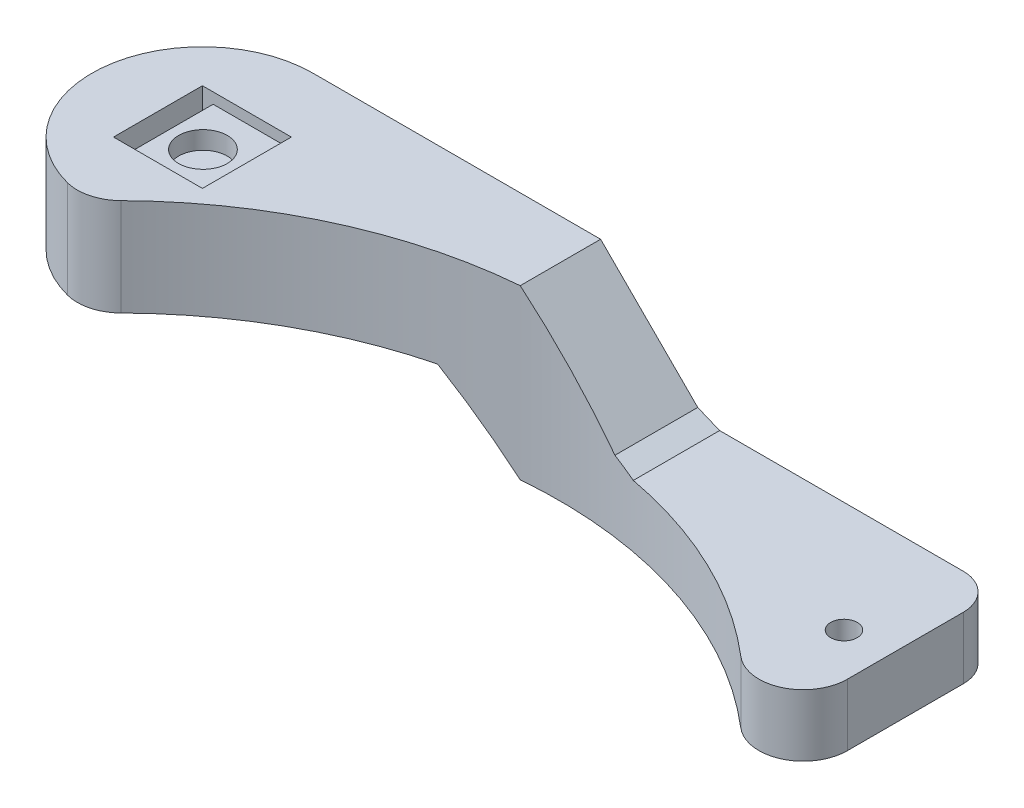
ISO-10303-21;
HEADER;
FILE_DESCRIPTION(('STEP AP214'),'2;1');
FILE_NAME('part.step','',(''),(''),'','','');
FILE_SCHEMA(('AUTOMOTIVE_DESIGN { 1 0 10303 214 1 1 1 1 }'));
ENDSEC;
DATA;
#1=APPLICATION_CONTEXT('core data for automotive mechanical design processes');
#2=APPLICATION_PROTOCOL_DEFINITION('international standard','automotive_design',2000,#1);
#3=PRODUCT_CONTEXT('',#1,'mechanical');
#4=PRODUCT('Part','Part','',(#3));
#5=PRODUCT_RELATED_PRODUCT_CATEGORY('part','',(#4));
#6=PRODUCT_DEFINITION_FORMATION('','',#4);
#7=PRODUCT_DEFINITION_CONTEXT('part definition',#1,'design');
#8=PRODUCT_DEFINITION('design','',#6,#7);
#9=PRODUCT_DEFINITION_SHAPE('','',#8);
#10=(LENGTH_UNIT() NAMED_UNIT(*) SI_UNIT(.MILLI.,.METRE.));
#11=(NAMED_UNIT(*) PLANE_ANGLE_UNIT() SI_UNIT($,.RADIAN.));
#12=(NAMED_UNIT(*) SI_UNIT($,.STERADIAN.) SOLID_ANGLE_UNIT());
#13=UNCERTAINTY_MEASURE_WITH_UNIT(LENGTH_MEASURE(1.E-05),#10,'distance_accuracy_value','');
#14=(GEOMETRIC_REPRESENTATION_CONTEXT(3) GLOBAL_UNCERTAINTY_ASSIGNED_CONTEXT((#13)) GLOBAL_UNIT_ASSIGNED_CONTEXT((#10,
#11,#12)) REPRESENTATION_CONTEXT('',''));
#15=CARTESIAN_POINT('',(0.,0.,0.));
#16=DIRECTION('',(0.,0.,1.));
#17=DIRECTION('',(1.,0.,0.));
#18=AXIS2_PLACEMENT_3D('',#15,#16,#17);
#19=CARTESIAN_POINT('',(10.9748737341531,8.02512626584707,-21.5));
#20=DIRECTION('',(0.382683432365087,0.923879532511288,0.));
#21=DIRECTION('',(0.,0.,1.));
#22=AXIS2_PLACEMENT_3D('',#19,#20,#21);
#23=PLANE('',#22);
#24=DIRECTION('',(0.,0.,-1.));
#25=VECTOR('',#24,1.);
#26=CARTESIAN_POINT('',(10.9748737341531,8.02512626584707,-3.14234152761216));
#27=LINE('',#26,#25);
#28=CARTESIAN_POINT('',(10.9748737341531,8.02512626584704,-3.14234152761216));
#29=VERTEX_POINT('',#28);
#30=CARTESIAN_POINT('',(10.9748737341531,8.02512626584706,-12.5));
#31=VERTEX_POINT('',#30);
#32=EDGE_CURVE('E224',#29,#31,#27,.T.);
#33=ORIENTED_EDGE('',*,*,#32,.F.);
#34=CARTESIAN_POINT('',(4.24999999999998,10.8106601717798,46.4033552911803));
#35=DIRECTION('',(0.382683432365087,0.923879532511288,0.));
#36=DIRECTION('',(0.923879532511288,-0.382683432365087,0.));
#37=AXIS2_PLACEMENT_3D('',#34,#35,#36);
#38=ELLIPSE('',#37,54.1196100146196,50.);
#39=CARTESIAN_POINT('',(13.449747468306,7.,-2.74300415201142));
#40=VERTEX_POINT('',#39);
#41=EDGE_CURVE('E48',#29,#40,#38,.F.);
#42=ORIENTED_EDGE('',*,*,#41,.T.);
#43=DIRECTION('',(0.,0.,1.));
#44=VECTOR('',#43,1.);
#45=CARTESIAN_POINT('',(13.449747468306,7.,-3.14234152761216));
#46=LINE('',#45,#44);
#47=CARTESIAN_POINT('',(13.449747468306,7.,-12.5));
#48=VERTEX_POINT('',#47);
#49=EDGE_CURVE('E227',#48,#40,#46,.T.);
#50=ORIENTED_EDGE('',*,*,#49,.F.);
#51=DIRECTION('',(-0.923879532511288,0.382683432365087,0.));
#52=VECTOR('',#51,1.);
#53=CARTESIAN_POINT('',(-40.6828733497066,29.4224657096208,-12.5));
#54=LINE('',#53,#52);
#55=EDGE_CURVE('E13',#48,#31,#54,.T.);
#56=ORIENTED_EDGE('',*,*,#55,.T.);
#57=EDGE_LOOP('',(#33,#42,#50,#56));
#58=FACE_BOUND('',#57,.T.);
#59=ADVANCED_FACE('F41',(#58),#23,.T.);
#60=CARTESIAN_POINT('',(-32.5,19.,0.));
#61=DIRECTION('',(0.,-1.,0.));
#62=DIRECTION('',(0.,0.,-1.));
#63=AXIS2_PLACEMENT_3D('',#60,#61,#62);
#64=CYLINDRICAL_SURFACE('',#63,12.5);
#65=CARTESIAN_POINT('',(-32.5,7.99999999999999,0.));
#66=DIRECTION('',(0.,-1.,0.));
#67=DIRECTION('',(1.,0.,0.));
#68=AXIS2_PLACEMENT_3D('',#65,#66,#67);
#69=CIRCLE('',#68,12.5);
#70=CARTESIAN_POINT('',(-35.6429668726142,7.99999999999999,12.0984197000125));
#71=VERTEX_POINT('',#70);
#72=CARTESIAN_POINT('',(-32.5,7.99999999999999,-12.5));
#73=VERTEX_POINT('',#72);
#74=EDGE_CURVE('E197',#71,#73,#69,.T.);
#75=ORIENTED_EDGE('',*,*,#74,.F.);
#76=DIRECTION('',(0.,-1.,0.));
#77=VECTOR('',#76,1.);
#78=CARTESIAN_POINT('',(-35.6429668726142,19.,12.0984197000125));
#79=LINE('',#78,#77);
#80=CARTESIAN_POINT('',(-35.6429668726142,19.,12.0984197000125));
#81=VERTEX_POINT('',#80);
#82=EDGE_CURVE('E214',#71,#81,#79,.F.);
#83=ORIENTED_EDGE('',*,*,#82,.T.);
#84=CARTESIAN_POINT('',(-32.5,19.,0.));
#85=DIRECTION('',(0.,1.,0.));
#86=DIRECTION('',(0.,0.,1.));
#87=AXIS2_PLACEMENT_3D('',#84,#85,#86);
#88=CIRCLE('',#87,12.5);
#89=CARTESIAN_POINT('',(-32.5,19.,-12.5));
#90=VERTEX_POINT('',#89);
#91=EDGE_CURVE('E201',#90,#81,#88,.T.);
#92=ORIENTED_EDGE('',*,*,#91,.F.);
#93=DIRECTION('',(0.,-1.,0.));
#94=VECTOR('',#93,1.);
#95=CARTESIAN_POINT('',(-32.5,19.,-12.5));
#96=LINE('',#95,#94);
#97=EDGE_CURVE('E359',#73,#90,#96,.F.);
#98=ORIENTED_EDGE('',*,*,#97,.F.);
#99=EDGE_LOOP('',(#75,#83,#92,#98));
#100=FACE_BOUND('',#99,.T.);
#101=ADVANCED_FACE('F397',(#100),#64,.T.);
#102=CARTESIAN_POINT('',(45.,19.,-12.5));
#103=DIRECTION('',(-1.,0.,0.));
#104=DIRECTION('',(0.,0.,1.));
#105=AXIS2_PLACEMENT_3D('',#102,#103,#104);
#106=PLANE('',#105);
#107=DIRECTION('',(0.,-1.,0.));
#108=VECTOR('',#107,1.);
#109=CARTESIAN_POINT('',(45.,19.,-8.5));
#110=LINE('',#109,#108);
#111=CARTESIAN_POINT('',(45.,0.,-8.5));
#112=VERTEX_POINT('',#111);
#113=CARTESIAN_POINT('',(45.,7.,-8.5));
#114=VERTEX_POINT('',#113);
#115=EDGE_CURVE('E199',#112,#114,#110,.F.);
#116=ORIENTED_EDGE('',*,*,#115,.T.);
#117=DIRECTION('',(0.,0.,1.));
#118=VECTOR('',#117,1.);
#119=CARTESIAN_POINT('',(45.,7.,-12.5));
#120=LINE('',#119,#118);
#121=CARTESIAN_POINT('',(45.,7.,4.60697386886097));
#122=VERTEX_POINT('',#121);
#123=EDGE_CURVE('E180',#114,#122,#120,.T.);
#124=ORIENTED_EDGE('',*,*,#123,.T.);
#125=DIRECTION('',(0.,-1.,0.));
#126=VECTOR('',#125,1.);
#127=CARTESIAN_POINT('',(45.,19.,4.60697386886097));
#128=LINE('',#127,#126);
#129=CARTESIAN_POINT('',(45.,0.,4.60697386886097));
#130=VERTEX_POINT('',#129);
#131=EDGE_CURVE('E218',#122,#130,#128,.T.);
#132=ORIENTED_EDGE('',*,*,#131,.T.);
#133=DIRECTION('',(0.,0.,-1.));
#134=VECTOR('',#133,1.);
#135=CARTESIAN_POINT('',(45.,0.,-12.5));
#136=LINE('',#135,#134);
#137=EDGE_CURVE('E339',#130,#112,#136,.T.);
#138=ORIENTED_EDGE('',*,*,#137,.T.);
#139=EDGE_LOOP('',(#116,#124,#132,#138));
#140=FACE_BOUND('',#139,.T.);
#141=ADVANCED_FACE('F395',(#140),#106,.F.);
#142=CARTESIAN_POINT('',(-45.,19.,-12.5));
#143=DIRECTION('',(0.,0.,1.));
#144=DIRECTION('',(1.,0.,0.));
#145=AXIS2_PLACEMENT_3D('',#142,#143,#144);
#146=PLANE('',#145);
#147=ORIENTED_EDGE('',*,*,#55,.F.);
#148=DIRECTION('',(1.,0.,0.));
#149=VECTOR('',#148,1.);
#150=CARTESIAN_POINT('',(11.0000000000001,7.,-12.5));
#151=LINE('',#150,#149);
#152=CARTESIAN_POINT('',(41.,7.,-12.5));
#153=VERTEX_POINT('',#152);
#154=EDGE_CURVE('E172',#48,#153,#151,.T.);
#155=ORIENTED_EDGE('',*,*,#154,.T.);
#156=DIRECTION('',(0.,-1.,0.));
#157=VECTOR('',#156,1.);
#158=CARTESIAN_POINT('',(41.,19.,-12.5));
#159=LINE('',#158,#157);
#160=CARTESIAN_POINT('',(41.,0.,-12.5));
#161=VERTEX_POINT('',#160);
#162=EDGE_CURVE('E177',#153,#161,#159,.T.);
#163=ORIENTED_EDGE('',*,*,#162,.T.);
#164=DIRECTION('',(-1.,0.,0.));
#165=VECTOR('',#164,1.);
#166=CARTESIAN_POINT('',(-45.,0.,-12.5));
#167=LINE('',#166,#165);
#168=CARTESIAN_POINT('',(0.,0.,-12.5));
#169=VERTEX_POINT('',#168);
#170=EDGE_CURVE('E350',#161,#169,#167,.T.);
#171=ORIENTED_EDGE('',*,*,#170,.T.);
#172=DIRECTION('',(-0.707106781186551,0.707106781186544,0.));
#173=VECTOR('',#172,1.);
#174=CARTESIAN_POINT('',(-32.0000000000002,31.9999999999999,-12.5));
#175=LINE('',#174,#173);
#176=CARTESIAN_POINT('',(-8.00000000000008,7.99999999999999,-12.5));
#177=VERTEX_POINT('',#176);
#178=EDGE_CURVE('E270',#169,#177,#175,.T.);
#179=ORIENTED_EDGE('',*,*,#178,.T.);
#180=DIRECTION('',(1.,0.,0.));
#181=VECTOR('',#180,1.);
#182=CARTESIAN_POINT('',(-45.,7.99999999999999,-12.5));
#183=LINE('',#182,#181);
#184=EDGE_CURVE('E357',#73,#177,#183,.T.);
#185=ORIENTED_EDGE('',*,*,#184,.F.);
#186=ORIENTED_EDGE('',*,*,#97,.T.);
#187=DIRECTION('',(-1.,0.,0.));
#188=VECTOR('',#187,1.);
#189=CARTESIAN_POINT('',(-45.,19.,-12.5));
#190=LINE('',#189,#188);
#191=CARTESIAN_POINT('',(0.,19.,-12.5));
#192=VERTEX_POINT('',#191);
#193=EDGE_CURVE('E346',#192,#90,#190,.T.);
#194=ORIENTED_EDGE('',*,*,#193,.F.);
#195=DIRECTION('',(0.707106781186552,-0.707106781186544,0.));
#196=VECTOR('',#195,1.);
#197=CARTESIAN_POINT('',(-22.5000000000003,41.5,-12.5));
#198=LINE('',#197,#196);
#199=EDGE_CURVE('E273',#192,#31,#198,.T.);
#200=ORIENTED_EDGE('',*,*,#199,.T.);
#201=EDGE_LOOP('',(#147,#155,#163,#171,#179,#185,#186,#194,#200));
#202=FACE_BOUND('',#201,.T.);
#203=ADVANCED_FACE('F174',(#202),#146,.F.);
#204=CARTESIAN_POINT('',(0.,19.,0.));
#205=DIRECTION('',(0.,1.,0.));
#206=DIRECTION('',(0.,0.,1.));
#207=AXIS2_PLACEMENT_3D('',#204,#205,#206);
#208=PLANE('',#207);
#209=ORIENTED_EDGE('',*,*,#91,.T.);
#210=CARTESIAN_POINT('',(-34.3857801235685,19.,7.25905182000749));
#211=DIRECTION('',(0.,1.,0.));
#212=DIRECTION('',(0.,0.,1.));
#213=AXIS2_PLACEMENT_3D('',#210,#211,#212);
#214=CIRCLE('',#213,5.);
#215=CARTESIAN_POINT('',(-30.8734364759714,19.,10.8176248628414));
#216=VERTEX_POINT('',#215);
#217=EDGE_CURVE('E216',#81,#216,#214,.T.);
#218=ORIENTED_EDGE('',*,*,#217,.T.);
#219=CARTESIAN_POINT('',(4.24999999999998,19.,46.4033552911803));
#220=DIRECTION('',(0.,-1.,0.));
#221=DIRECTION('',(0.,0.,-1.));
#222=AXIS2_PLACEMENT_3D('',#219,#220,#221);
#223=CIRCLE('',#222,50.);
#224=CARTESIAN_POINT('',(0.,19.,-3.4156922709721));
#225=VERTEX_POINT('',#224);
#226=EDGE_CURVE('E241',#216,#225,#223,.T.);
#227=ORIENTED_EDGE('',*,*,#226,.T.);
#228=DIRECTION('',(0.,0.,1.));
#229=VECTOR('',#228,1.);
#230=CARTESIAN_POINT('',(0.,19.,0.));
#231=LINE('',#230,#229);
#232=EDGE_CURVE('E354',#192,#225,#231,.T.);
#233=ORIENTED_EDGE('',*,*,#232,.F.);
#234=ORIENTED_EDGE('',*,*,#193,.T.);
#235=EDGE_LOOP('',(#209,#218,#227,#233,#234));
#236=FACE_BOUND('',#235,.T.);
#237=DIRECTION('',(0.,0.,1.));
#238=VECTOR('',#237,1.);
#239=CARTESIAN_POINT('',(-37.525,19.,-5.025));
#240=LINE('',#239,#238);
#241=CARTESIAN_POINT('',(-37.525,19.,-5.025));
#242=VERTEX_POINT('',#241);
#243=CARTESIAN_POINT('',(-37.525,19.,5.025));
#244=VERTEX_POINT('',#243);
#245=EDGE_CURVE('E301',#242,#244,#240,.T.);
#246=ORIENTED_EDGE('',*,*,#245,.F.);
#247=DIRECTION('',(-1.,0.,0.));
#248=VECTOR('',#247,1.);
#249=CARTESIAN_POINT('',(-37.525,19.,-5.025));
#250=LINE('',#249,#248);
#251=CARTESIAN_POINT('',(-27.475,19.,-5.025));
#252=VERTEX_POINT('',#251);
#253=EDGE_CURVE('E324',#252,#242,#250,.T.);
#254=ORIENTED_EDGE('',*,*,#253,.F.);
#255=DIRECTION('',(0.,0.,-1.));
#256=VECTOR('',#255,1.);
#257=CARTESIAN_POINT('',(-27.475,19.,-5.025));
#258=LINE('',#257,#256);
#259=CARTESIAN_POINT('',(-27.475,19.,5.025));
#260=VERTEX_POINT('',#259);
#261=EDGE_CURVE('E332',#260,#252,#258,.T.);
#262=ORIENTED_EDGE('',*,*,#261,.F.);
#263=DIRECTION('',(1.,0.,0.));
#264=VECTOR('',#263,1.);
#265=CARTESIAN_POINT('',(-37.525,19.,5.025));
#266=LINE('',#265,#264);
#267=EDGE_CURVE('E329',#244,#260,#266,.T.);
#268=ORIENTED_EDGE('',*,*,#267,.F.);
#269=EDGE_LOOP('',(#246,#254,#262,#268));
#270=FACE_BOUND('',#269,.T.);
#271=ADVANCED_FACE('F364',(#236,#270),#208,.T.);
#272=CARTESIAN_POINT('',(0.,0.,0.));
#273=DIRECTION('',(0.,1.,0.));
#274=DIRECTION('',(0.,0.,1.));
#275=AXIS2_PLACEMENT_3D('',#272,#273,#274);
#276=PLANE('',#275);
#277=CARTESIAN_POINT('',(40.,0.,0.));
#278=DIRECTION('',(0.,-1.,0.));
#279=DIRECTION('',(0.,0.,-1.));
#280=AXIS2_PLACEMENT_3D('',#277,#278,#279);
#281=CIRCLE('',#280,1.5);
#282=CARTESIAN_POINT('',(40.,0.,-1.5));
#283=VERTEX_POINT('',#282);
#284=EDGE_CURVE('E252',#283,#283,#281,.T.);
#285=ORIENTED_EDGE('',*,*,#284,.F.);
#286=EDGE_LOOP('',(#285));
#287=FACE_BOUND('',#286,.T.);
#288=ORIENTED_EDGE('',*,*,#137,.F.);
#289=CARTESIAN_POINT('',(40.,0.,4.60697386886097));
#290=DIRECTION('',(0.,1.,0.));
#291=DIRECTION('',(0.,0.,1.));
#292=AXIS2_PLACEMENT_3D('',#289,#290,#291);
#293=CIRCLE('',#292,5.);
#294=CARTESIAN_POINT('',(36.75,0.,8.40664490725364));
#295=VERTEX_POINT('',#294);
#296=EDGE_CURVE('E220',#130,#295,#293,.F.);
#297=ORIENTED_EDGE('',*,*,#296,.T.);
#298=CARTESIAN_POINT('',(4.24999999999998,0.,46.4033552911803));
#299=DIRECTION('',(0.,-1.,0.));
#300=DIRECTION('',(0.,0.,-1.));
#301=AXIS2_PLACEMENT_3D('',#298,#299,#300);
#302=CIRCLE('',#301,50.);
#303=CARTESIAN_POINT('',(0.,0.,-3.4156922709721));
#304=VERTEX_POINT('',#303);
#305=EDGE_CURVE('E240',#304,#295,#302,.T.);
#306=ORIENTED_EDGE('',*,*,#305,.F.);
#307=DIRECTION('',(0.,0.,-1.));
#308=VECTOR('',#307,1.);
#309=CARTESIAN_POINT('',(0.,0.,0.));
#310=LINE('',#309,#308);
#311=EDGE_CURVE('E349',#304,#169,#310,.T.);
#312=ORIENTED_EDGE('',*,*,#311,.T.);
#313=ORIENTED_EDGE('',*,*,#170,.F.);
#314=CARTESIAN_POINT('',(41.,0.,-8.5));
#315=DIRECTION('',(0.,1.,0.));
#316=DIRECTION('',(0.,0.,1.));
#317=AXIS2_PLACEMENT_3D('',#314,#315,#316);
#318=CIRCLE('',#317,4.);
#319=EDGE_CURVE('E195',#161,#112,#318,.F.);
#320=ORIENTED_EDGE('',*,*,#319,.T.);
#321=EDGE_LOOP('',(#288,#297,#306,#312,#313,#320));
#322=FACE_BOUND('',#321,.T.);
#323=ADVANCED_FACE('F388',(#287,#322),#276,.F.);
#324=CARTESIAN_POINT('',(-37.525,17.79,-5.025));
#325=DIRECTION('',(-1.,0.,0.));
#326=DIRECTION('',(0.,0.,1.));
#327=AXIS2_PLACEMENT_3D('',#324,#325,#326);
#328=PLANE('',#327);
#329=ORIENTED_EDGE('',*,*,#245,.T.);
#330=DIRECTION('',(0.,1.,0.));
#331=VECTOR('',#330,1.);
#332=CARTESIAN_POINT('',(-37.525,17.79,5.025));
#333=LINE('',#332,#331);
#334=CARTESIAN_POINT('',(-37.525,15.77,5.025));
#335=VERTEX_POINT('',#334);
#336=EDGE_CURVE('E327',#335,#244,#333,.T.);
#337=ORIENTED_EDGE('',*,*,#336,.F.);
#338=DIRECTION('',(0.,0.,1.));
#339=VECTOR('',#338,1.);
#340=CARTESIAN_POINT('',(-37.525,15.77,5.025));
#341=LINE('',#340,#339);
#342=CARTESIAN_POINT('',(-37.525,15.77,-5.025));
#343=VERTEX_POINT('',#342);
#344=EDGE_CURVE('E303',#343,#335,#341,.T.);
#345=ORIENTED_EDGE('',*,*,#344,.F.);
#346=DIRECTION('',(0.,1.,0.));
#347=VECTOR('',#346,1.);
#348=CARTESIAN_POINT('',(-37.525,17.79,-5.025));
#349=LINE('',#348,#347);
#350=EDGE_CURVE('E337',#343,#242,#349,.T.);
#351=ORIENTED_EDGE('',*,*,#350,.T.);
#352=EDGE_LOOP('',(#329,#337,#345,#351));
#353=FACE_BOUND('',#352,.T.);
#354=ADVANCED_FACE('F458',(#353),#328,.F.);
#355=CARTESIAN_POINT('',(-37.525,17.79,-5.025));
#356=DIRECTION('',(0.,0.,-1.));
#357=DIRECTION('',(-1.,0.,0.));
#358=AXIS2_PLACEMENT_3D('',#355,#356,#357);
#359=PLANE('',#358);
#360=ORIENTED_EDGE('',*,*,#253,.T.);
#361=ORIENTED_EDGE('',*,*,#350,.F.);
#362=DIRECTION('',(-1.,0.,0.));
#363=VECTOR('',#362,1.);
#364=CARTESIAN_POINT('',(-37.525,15.77,-5.025));
#365=LINE('',#364,#363);
#366=CARTESIAN_POINT('',(-36.315,15.77,-5.025));
#367=VERTEX_POINT('',#366);
#368=EDGE_CURVE('E312',#367,#343,#365,.T.);
#369=ORIENTED_EDGE('',*,*,#368,.F.);
#370=DIRECTION('',(0.,1.,0.));
#371=VECTOR('',#370,1.);
#372=CARTESIAN_POINT('',(-36.315,15.77,-5.025));
#373=LINE('',#372,#371);
#374=CARTESIAN_POINT('',(-36.315,17.79,-5.025));
#375=VERTEX_POINT('',#374);
#376=EDGE_CURVE('E298',#367,#375,#373,.T.);
#377=ORIENTED_EDGE('',*,*,#376,.T.);
#378=DIRECTION('',(-1.,0.,0.));
#379=VECTOR('',#378,1.);
#380=CARTESIAN_POINT('',(-37.525,17.79,-5.025));
#381=LINE('',#380,#379);
#382=CARTESIAN_POINT('',(-28.685,17.79,-5.025));
#383=VERTEX_POINT('',#382);
#384=EDGE_CURVE('E323',#383,#375,#381,.T.);
#385=ORIENTED_EDGE('',*,*,#384,.F.);
#386=DIRECTION('',(0.,1.,0.));
#387=VECTOR('',#386,1.);
#388=CARTESIAN_POINT('',(-28.685,15.77,-5.025));
#389=LINE('',#388,#387);
#390=CARTESIAN_POINT('',(-28.685,15.77,-5.025));
#391=VERTEX_POINT('',#390);
#392=EDGE_CURVE('E295',#391,#383,#389,.T.);
#393=ORIENTED_EDGE('',*,*,#392,.F.);
#394=DIRECTION('',(-1.,0.,0.));
#395=VECTOR('',#394,1.);
#396=CARTESIAN_POINT('',(-27.475,15.77,-5.025));
#397=LINE('',#396,#395);
#398=CARTESIAN_POINT('',(-27.475,15.77,-5.025));
#399=VERTEX_POINT('',#398);
#400=EDGE_CURVE('E282',#399,#391,#397,.T.);
#401=ORIENTED_EDGE('',*,*,#400,.F.);
#402=DIRECTION('',(0.,1.,0.));
#403=VECTOR('',#402,1.);
#404=CARTESIAN_POINT('',(-27.475,17.79,-5.025));
#405=LINE('',#404,#403);
#406=EDGE_CURVE('E340',#399,#252,#405,.T.);
#407=ORIENTED_EDGE('',*,*,#406,.T.);
#408=EDGE_LOOP('',(#360,#361,#369,#377,#385,#393,#401,#407));
#409=FACE_BOUND('',#408,.T.);
#410=ADVANCED_FACE('F454',(#409),#359,.F.);
#411=CARTESIAN_POINT('',(-27.475,17.79,-5.025));
#412=DIRECTION('',(1.,0.,0.));
#413=DIRECTION('',(0.,0.,-1.));
#414=AXIS2_PLACEMENT_3D('',#411,#412,#413);
#415=PLANE('',#414);
#416=ORIENTED_EDGE('',*,*,#261,.T.);
#417=ORIENTED_EDGE('',*,*,#406,.F.);
#418=DIRECTION('',(0.,0.,-1.));
#419=VECTOR('',#418,1.);
#420=CARTESIAN_POINT('',(-27.475,15.77,5.025));
#421=LINE('',#420,#419);
#422=CARTESIAN_POINT('',(-27.475,15.77,5.025));
#423=VERTEX_POINT('',#422);
#424=EDGE_CURVE('E292',#423,#399,#421,.T.);
#425=ORIENTED_EDGE('',*,*,#424,.F.);
#426=DIRECTION('',(0.,1.,0.));
#427=VECTOR('',#426,1.);
#428=CARTESIAN_POINT('',(-27.475,17.79,5.025));
#429=LINE('',#428,#427);
#430=EDGE_CURVE('E342',#423,#260,#429,.T.);
#431=ORIENTED_EDGE('',*,*,#430,.T.);
#432=EDGE_LOOP('',(#416,#417,#425,#431));
#433=FACE_BOUND('',#432,.T.);
#434=ADVANCED_FACE('F457',(#433),#415,.F.);
#435=CARTESIAN_POINT('',(-37.525,17.79,5.025));
#436=DIRECTION('',(0.,0.,1.));
#437=DIRECTION('',(1.,0.,0.));
#438=AXIS2_PLACEMENT_3D('',#435,#436,#437);
#439=PLANE('',#438);
#440=ORIENTED_EDGE('',*,*,#267,.T.);
#441=ORIENTED_EDGE('',*,*,#430,.F.);
#442=DIRECTION('',(1.,0.,0.));
#443=VECTOR('',#442,1.);
#444=CARTESIAN_POINT('',(-28.685,15.77,5.025));
#445=LINE('',#444,#443);
#446=CARTESIAN_POINT('',(-28.685,15.77,5.025));
#447=VERTEX_POINT('',#446);
#448=EDGE_CURVE('E289',#447,#423,#445,.T.);
#449=ORIENTED_EDGE('',*,*,#448,.F.);
#450=DIRECTION('',(0.,1.,0.));
#451=VECTOR('',#450,1.);
#452=CARTESIAN_POINT('',(-28.685,15.77,5.025));
#453=LINE('',#452,#451);
#454=CARTESIAN_POINT('',(-28.685,17.79,5.025));
#455=VERTEX_POINT('',#454);
#456=EDGE_CURVE('E299',#447,#455,#453,.T.);
#457=ORIENTED_EDGE('',*,*,#456,.T.);
#458=DIRECTION('',(1.,0.,0.));
#459=VECTOR('',#458,1.);
#460=CARTESIAN_POINT('',(-37.525,17.79,5.025));
#461=LINE('',#460,#459);
#462=CARTESIAN_POINT('',(-36.315,17.79,5.025));
#463=VERTEX_POINT('',#462);
#464=EDGE_CURVE('E320',#463,#455,#461,.T.);
#465=ORIENTED_EDGE('',*,*,#464,.F.);
#466=DIRECTION('',(0.,1.,0.));
#467=VECTOR('',#466,1.);
#468=CARTESIAN_POINT('',(-36.315,15.77,5.025));
#469=LINE('',#468,#467);
#470=CARTESIAN_POINT('',(-36.315,15.77,5.025));
#471=VERTEX_POINT('',#470);
#472=EDGE_CURVE('E315',#471,#463,#469,.T.);
#473=ORIENTED_EDGE('',*,*,#472,.F.);
#474=DIRECTION('',(1.,0.,0.));
#475=VECTOR('',#474,1.);
#476=CARTESIAN_POINT('',(-36.315,15.77,5.025));
#477=LINE('',#476,#475);
#478=EDGE_CURVE('E306',#335,#471,#477,.T.);
#479=ORIENTED_EDGE('',*,*,#478,.F.);
#480=ORIENTED_EDGE('',*,*,#336,.T.);
#481=EDGE_LOOP('',(#440,#441,#449,#457,#465,#473,#479,#480));
#482=FACE_BOUND('',#481,.T.);
#483=ADVANCED_FACE('F452',(#482),#439,.F.);
#484=CARTESIAN_POINT('',(0.,17.79,0.));
#485=DIRECTION('',(0.,1.,0.));
#486=DIRECTION('',(0.,0.,1.));
#487=AXIS2_PLACEMENT_3D('',#484,#485,#486);
#488=PLANE('',#487);
#489=CARTESIAN_POINT('',(-32.465,17.79,-0.0249999999999998));
#490=DIRECTION('',(0.,1.,0.));
#491=DIRECTION('',(0.,0.,1.));
#492=AXIS2_PLACEMENT_3D('',#489,#490,#491);
#493=CIRCLE('',#492,2.75);
#494=CARTESIAN_POINT('',(-32.465,17.79,2.725));
#495=VERTEX_POINT('',#494);
#496=EDGE_CURVE('E275',#495,#495,#493,.T.);
#497=ORIENTED_EDGE('',*,*,#496,.F.);
#498=EDGE_LOOP('',(#497));
#499=FACE_BOUND('',#498,.T.);
#500=DIRECTION('',(0.,0.,1.));
#501=VECTOR('',#500,1.);
#502=CARTESIAN_POINT('',(-28.685,17.79,-5.025));
#503=LINE('',#502,#501);
#504=EDGE_CURVE('E286',#383,#455,#503,.T.);
#505=ORIENTED_EDGE('',*,*,#504,.F.);
#506=ORIENTED_EDGE('',*,*,#384,.T.);
#507=DIRECTION('',(0.,0.,-1.));
#508=VECTOR('',#507,1.);
#509=CARTESIAN_POINT('',(-36.315,17.79,-5.025));
#510=LINE('',#509,#508);
#511=EDGE_CURVE('E279',#463,#375,#510,.T.);
#512=ORIENTED_EDGE('',*,*,#511,.F.);
#513=ORIENTED_EDGE('',*,*,#464,.T.);
#514=EDGE_LOOP('',(#505,#506,#512,#513));
#515=FACE_BOUND('',#514,.T.);
#516=ADVANCED_FACE('F448',(#499,#515),#488,.T.);
#517=CARTESIAN_POINT('',(-36.315,15.77,-5.025));
#518=DIRECTION('',(1.,0.,0.));
#519=DIRECTION('',(0.,0.,-1.));
#520=AXIS2_PLACEMENT_3D('',#517,#518,#519);
#521=PLANE('',#520);
#522=ORIENTED_EDGE('',*,*,#511,.T.);
#523=ORIENTED_EDGE('',*,*,#376,.F.);
#524=DIRECTION('',(0.,0.,-1.));
#525=VECTOR('',#524,1.);
#526=CARTESIAN_POINT('',(-36.315,15.77,-5.025));
#527=LINE('',#526,#525);
#528=EDGE_CURVE('E309',#471,#367,#527,.T.);
#529=ORIENTED_EDGE('',*,*,#528,.F.);
#530=ORIENTED_EDGE('',*,*,#472,.T.);
#531=EDGE_LOOP('',(#522,#523,#529,#530));
#532=FACE_BOUND('',#531,.T.);
#533=ADVANCED_FACE('F444',(#532),#521,.F.);
#534=CARTESIAN_POINT('',(0.,15.77,0.));
#535=DIRECTION('',(0.,-1.,0.));
#536=DIRECTION('',(0.,0.,-1.));
#537=AXIS2_PLACEMENT_3D('',#534,#535,#536);
#538=PLANE('',#537);
#539=ORIENTED_EDGE('',*,*,#344,.T.);
#540=ORIENTED_EDGE('',*,*,#478,.T.);
#541=ORIENTED_EDGE('',*,*,#528,.T.);
#542=ORIENTED_EDGE('',*,*,#368,.T.);
#543=EDGE_LOOP('',(#539,#540,#541,#542));
#544=FACE_BOUND('',#543,.T.);
#545=ADVANCED_FACE('F440',(#544),#538,.F.);
#546=CARTESIAN_POINT('',(-28.685,15.77,-5.025));
#547=DIRECTION('',(-1.,0.,0.));
#548=DIRECTION('',(0.,0.,1.));
#549=AXIS2_PLACEMENT_3D('',#546,#547,#548);
#550=PLANE('',#549);
#551=ORIENTED_EDGE('',*,*,#504,.T.);
#552=ORIENTED_EDGE('',*,*,#456,.F.);
#553=DIRECTION('',(0.,0.,1.));
#554=VECTOR('',#553,1.);
#555=CARTESIAN_POINT('',(-28.685,15.77,-5.025));
#556=LINE('',#555,#554);
#557=EDGE_CURVE('E285',#391,#447,#556,.T.);
#558=ORIENTED_EDGE('',*,*,#557,.F.);
#559=ORIENTED_EDGE('',*,*,#392,.T.);
#560=EDGE_LOOP('',(#551,#552,#558,#559));
#561=FACE_BOUND('',#560,.T.);
#562=ADVANCED_FACE('F436',(#561),#550,.F.);
#563=CARTESIAN_POINT('',(0.,15.77,0.));
#564=DIRECTION('',(0.,1.,0.));
#565=DIRECTION('',(0.,0.,1.));
#566=AXIS2_PLACEMENT_3D('',#563,#564,#565);
#567=PLANE('',#566);
#568=ORIENTED_EDGE('',*,*,#400,.T.);
#569=ORIENTED_EDGE('',*,*,#557,.T.);
#570=ORIENTED_EDGE('',*,*,#448,.T.);
#571=ORIENTED_EDGE('',*,*,#424,.T.);
#572=EDGE_LOOP('',(#568,#569,#570,#571));
#573=FACE_BOUND('',#572,.T.);
#574=ADVANCED_FACE('F432',(#573),#567,.T.);
#575=CARTESIAN_POINT('',(-32.465,15.77,-0.0249999999999998));
#576=DIRECTION('',(0.,1.,0.));
#577=DIRECTION('',(0.,0.,1.));
#578=AXIS2_PLACEMENT_3D('',#575,#576,#577);
#579=CYLINDRICAL_SURFACE('',#578,2.75);
#580=CARTESIAN_POINT('',(-32.465,15.77,-0.0249999999999998));
#581=DIRECTION('',(0.,1.,0.));
#582=DIRECTION('',(0.,0.,1.));
#583=AXIS2_PLACEMENT_3D('',#580,#581,#582);
#584=CIRCLE('',#583,2.75);
#585=CARTESIAN_POINT('',(-32.465,15.77,2.725));
#586=VERTEX_POINT('',#585);
#587=EDGE_CURVE('E276',#586,#586,#584,.T.);
#588=ORIENTED_EDGE('',*,*,#587,.F.);
#589=EDGE_LOOP('',(#588));
#590=FACE_BOUND('',#589,.T.);
#591=ORIENTED_EDGE('',*,*,#496,.T.);
#592=EDGE_LOOP('',(#591));
#593=FACE_BOUND('',#592,.T.);
#594=ADVANCED_FACE('F428',(#590,#593),#579,.F.);
#595=CARTESIAN_POINT('',(-32.465,15.77,-0.0249999999999998));
#596=DIRECTION('',(0.,1.,0.));
#597=DIRECTION('',(0.,0.,1.));
#598=AXIS2_PLACEMENT_3D('',#595,#596,#597);
#599=PLANE('',#598);
#600=ORIENTED_EDGE('',*,*,#587,.T.);
#601=EDGE_LOOP('',(#600));
#602=FACE_BOUND('',#601,.T.);
#603=ADVANCED_FACE('F424',(#602),#599,.T.);
#604=CARTESIAN_POINT('',(0.,7.99999999999999,-21.5));
#605=DIRECTION('',(0.,-1.,0.));
#606=DIRECTION('',(1.,0.,0.));
#607=AXIS2_PLACEMENT_3D('',#604,#605,#606);
#608=PLANE('',#607);
#609=CARTESIAN_POINT('',(4.24999999999998,7.99999999999999,46.4033552911803));
#610=DIRECTION('',(0.,-1.,0.));
#611=DIRECTION('',(1.,0.,0.));
#612=AXIS2_PLACEMENT_3D('',#609,#610,#611);
#613=CIRCLE('',#612,50.);
#614=CARTESIAN_POINT('',(-30.8734364759714,7.99999999999999,10.8176248628414));
#615=VERTEX_POINT('',#614);
#616=CARTESIAN_POINT('',(-8.00000000000008,7.99999999999999,-2.07279864041785));
#617=VERTEX_POINT('',#616);
#618=EDGE_CURVE('E250',#615,#617,#613,.T.);
#619=ORIENTED_EDGE('',*,*,#618,.F.);
#620=CARTESIAN_POINT('',(-34.3857801235685,7.99999999999999,7.25905182000749));
#621=DIRECTION('',(0.,-1.,0.));
#622=DIRECTION('',(1.,0.,0.));
#623=AXIS2_PLACEMENT_3D('',#620,#621,#622);
#624=CIRCLE('',#623,5.);
#625=EDGE_CURVE('E212',#615,#71,#624,.T.);
#626=ORIENTED_EDGE('',*,*,#625,.T.);
#627=ORIENTED_EDGE('',*,*,#74,.T.);
#628=ORIENTED_EDGE('',*,*,#184,.T.);
#629=DIRECTION('',(0.,0.,1.));
#630=VECTOR('',#629,1.);
#631=CARTESIAN_POINT('',(-8.00000000000008,7.99999999999999,-21.5));
#632=LINE('',#631,#630);
#633=EDGE_CURVE('E265',#177,#617,#632,.T.);
#634=ORIENTED_EDGE('',*,*,#633,.T.);
#635=EDGE_LOOP('',(#619,#626,#627,#628,#634));
#636=FACE_BOUND('',#635,.T.);
#637=CARTESIAN_POINT('',(-32.5,7.99999999999999,0.));
#638=DIRECTION('',(0.,-1.,0.));
#639=DIRECTION('',(1.,0.,0.));
#640=AXIS2_PLACEMENT_3D('',#637,#638,#639);
#641=CIRCLE('',#640,6.96);
#642=CARTESIAN_POINT('',(-25.54,7.99999999999999,0.));
#643=VERTEX_POINT('',#642);
#644=EDGE_CURVE('E259',#643,#643,#641,.T.);
#645=ORIENTED_EDGE('',*,*,#644,.F.);
#646=EDGE_LOOP('',(#645));
#647=FACE_BOUND('',#646,.T.);
#648=ADVANCED_FACE('F377',(#636,#647),#608,.T.);
#649=CARTESIAN_POINT('',(0.,0.,-21.5));
#650=DIRECTION('',(0.707106781186544,0.707106781186552,0.));
#651=DIRECTION('',(-0.707106781186551,0.707106781186544,0.));
#652=AXIS2_PLACEMENT_3D('',#649,#650,#651);
#653=PLANE('',#652);
#654=ORIENTED_EDGE('',*,*,#311,.F.);
#655=CARTESIAN_POINT('',(4.24999999999998,-4.24999999999993,46.4033552911803));
#656=DIRECTION('',(0.707106781186544,0.707106781186552,0.));
#657=DIRECTION('',(0.707106781186551,-0.707106781186544,0.));
#658=AXIS2_PLACEMENT_3D('',#655,#656,#657);
#659=ELLIPSE('',#658,70.7106781186543,50.);
#660=EDGE_CURVE('E247',#304,#617,#659,.T.);
#661=ORIENTED_EDGE('',*,*,#660,.T.);
#662=ORIENTED_EDGE('',*,*,#633,.F.);
#663=ORIENTED_EDGE('',*,*,#178,.F.);
#664=EDGE_LOOP('',(#654,#661,#662,#663));
#665=FACE_BOUND('',#664,.T.);
#666=ADVANCED_FACE('F385',(#665),#653,.F.);
#667=CARTESIAN_POINT('',(9.5,9.5000000000001,-21.5));
#668=DIRECTION('',(-0.707106781186544,-0.707106781186552,0.));
#669=DIRECTION('',(0.707106781186552,-0.707106781186544,0.));
#670=AXIS2_PLACEMENT_3D('',#667,#668,#669);
#671=PLANE('',#670);
#672=CARTESIAN_POINT('',(4.24999999999998,14.7500000000001,46.4033552911803));
#673=DIRECTION('',(-0.707106781186544,-0.707106781186552,0.));
#674=DIRECTION('',(0.707106781186552,-0.707106781186544,0.));
#675=AXIS2_PLACEMENT_3D('',#672,#673,#674);
#676=ELLIPSE('',#675,70.7106781186543,50.);
#677=EDGE_CURVE('E243',#225,#29,#676,.T.);
#678=ORIENTED_EDGE('',*,*,#677,.T.);
#679=ORIENTED_EDGE('',*,*,#32,.T.);
#680=ORIENTED_EDGE('',*,*,#199,.F.);
#681=ORIENTED_EDGE('',*,*,#232,.T.);
#682=EDGE_LOOP('',(#678,#679,#680,#681));
#683=FACE_BOUND('',#682,.T.);
#684=ADVANCED_FACE('F409',(#683),#671,.F.);
#685=CARTESIAN_POINT('',(-32.5,9.09999999999999,0.));
#686=DIRECTION('',(0.,-1.,0.));
#687=DIRECTION('',(1.,0.,0.));
#688=AXIS2_PLACEMENT_3D('',#685,#686,#687);
#689=CYLINDRICAL_SURFACE('',#688,6.96);
#690=CARTESIAN_POINT('',(-32.5,9.09999999999999,0.));
#691=DIRECTION('',(0.,-1.,0.));
#692=DIRECTION('',(1.,0.,0.));
#693=AXIS2_PLACEMENT_3D('',#690,#691,#692);
#694=CIRCLE('',#693,6.96);
#695=CARTESIAN_POINT('',(-25.54,9.09999999999999,0.));
#696=VERTEX_POINT('',#695);
#697=EDGE_CURVE('E262',#696,#696,#694,.T.);
#698=ORIENTED_EDGE('',*,*,#697,.F.);
#699=EDGE_LOOP('',(#698));
#700=FACE_BOUND('',#699,.T.);
#701=ORIENTED_EDGE('',*,*,#644,.T.);
#702=EDGE_LOOP('',(#701));
#703=FACE_BOUND('',#702,.T.);
#704=ADVANCED_FACE('F411',(#700,#703),#689,.F.);
#705=CARTESIAN_POINT('',(-32.5,9.09999999999999,0.));
#706=DIRECTION('',(0.,-1.,0.));
#707=DIRECTION('',(1.,0.,0.));
#708=AXIS2_PLACEMENT_3D('',#705,#706,#707);
#709=PLANE('',#708);
#710=CARTESIAN_POINT('',(-32.5,9.09999999999999,0.));
#711=DIRECTION('',(0.,-1.,0.));
#712=DIRECTION('',(1.,0.,0.));
#713=AXIS2_PLACEMENT_3D('',#710,#711,#712);
#714=CIRCLE('',#713,6.4);
#715=CARTESIAN_POINT('',(-26.1,9.09999999999999,0.));
#716=VERTEX_POINT('',#715);
#717=EDGE_CURVE('E255',#716,#716,#714,.T.);
#718=ORIENTED_EDGE('',*,*,#717,.F.);
#719=EDGE_LOOP('',(#718));
#720=FACE_BOUND('',#719,.T.);
#721=ORIENTED_EDGE('',*,*,#697,.T.);
#722=EDGE_LOOP('',(#721));
#723=FACE_BOUND('',#722,.T.);
#724=ADVANCED_FACE('F417',(#720,#723),#709,.T.);
#725=CARTESIAN_POINT('',(-32.5,12.7,0.));
#726=DIRECTION('',(0.,-1.,0.));
#727=DIRECTION('',(1.,0.,0.));
#728=AXIS2_PLACEMENT_3D('',#725,#726,#727);
#729=CYLINDRICAL_SURFACE('',#728,6.4);
#730=CARTESIAN_POINT('',(-32.5,12.7,0.));
#731=DIRECTION('',(0.,-1.,0.));
#732=DIRECTION('',(1.,0.,0.));
#733=AXIS2_PLACEMENT_3D('',#730,#731,#732);
#734=CIRCLE('',#733,6.4);
#735=CARTESIAN_POINT('',(-26.1,12.7,0.));
#736=VERTEX_POINT('',#735);
#737=EDGE_CURVE('E256',#736,#736,#734,.T.);
#738=ORIENTED_EDGE('',*,*,#737,.F.);
#739=EDGE_LOOP('',(#738));
#740=FACE_BOUND('',#739,.T.);
#741=ORIENTED_EDGE('',*,*,#717,.T.);
#742=EDGE_LOOP('',(#741));
#743=FACE_BOUND('',#742,.T.);
#744=ADVANCED_FACE('F487',(#740,#743),#729,.F.);
#745=CARTESIAN_POINT('',(-32.5,12.7,0.));
#746=DIRECTION('',(0.,-1.,0.));
#747=DIRECTION('',(1.,0.,0.));
#748=AXIS2_PLACEMENT_3D('',#745,#746,#747);
#749=PLANE('',#748);
#750=ORIENTED_EDGE('',*,*,#737,.T.);
#751=EDGE_LOOP('',(#750));
#752=FACE_BOUND('',#751,.T.);
#753=ADVANCED_FACE('F479',(#752),#749,.T.);
#754=CARTESIAN_POINT('',(40.,19.,0.));
#755=DIRECTION('',(0.,-1.,0.));
#756=DIRECTION('',(0.,0.,-1.));
#757=AXIS2_PLACEMENT_3D('',#754,#755,#756);
#758=CYLINDRICAL_SURFACE('',#757,1.5);
#759=CARTESIAN_POINT('',(40.,7.,0.));
#760=DIRECTION('',(0.,-1.,0.));
#761=DIRECTION('',(0.,0.,-1.));
#762=AXIS2_PLACEMENT_3D('',#759,#760,#761);
#763=CIRCLE('',#762,1.5);
#764=CARTESIAN_POINT('',(40.,7.,-1.5));
#765=VERTEX_POINT('',#764);
#766=EDGE_CURVE('E190',#765,#765,#763,.F.);
#767=ORIENTED_EDGE('',*,*,#766,.T.);
#768=EDGE_LOOP('',(#767));
#769=FACE_BOUND('',#768,.T.);
#770=ORIENTED_EDGE('',*,*,#284,.T.);
#771=EDGE_LOOP('',(#770));
#772=FACE_BOUND('',#771,.T.);
#773=ADVANCED_FACE('F477',(#769,#772),#758,.F.);
#774=CARTESIAN_POINT('',(41.,19.,-8.5));
#775=DIRECTION('',(0.,-1.,0.));
#776=DIRECTION('',(0.,0.,-1.));
#777=AXIS2_PLACEMENT_3D('',#774,#775,#776);
#778=CYLINDRICAL_SURFACE('',#777,4.);
#779=CARTESIAN_POINT('',(41.,7.,-8.5));
#780=DIRECTION('',(0.,-1.,0.));
#781=DIRECTION('',(0.,0.,-1.));
#782=AXIS2_PLACEMENT_3D('',#779,#780,#781);
#783=CIRCLE('',#782,4.);
#784=EDGE_CURVE('E183',#114,#153,#783,.F.);
#785=ORIENTED_EDGE('',*,*,#784,.F.);
#786=ORIENTED_EDGE('',*,*,#115,.F.);
#787=ORIENTED_EDGE('',*,*,#319,.F.);
#788=ORIENTED_EDGE('',*,*,#162,.F.);
#789=EDGE_LOOP('',(#785,#786,#787,#788));
#790=FACE_BOUND('',#789,.T.);
#791=ADVANCED_FACE('F193',(#790),#778,.T.);
#792=CARTESIAN_POINT('',(4.24999999999998,19.,46.4033552911803));
#793=DIRECTION('',(0.,-1.,0.));
#794=DIRECTION('',(0.,0.,-1.));
#795=AXIS2_PLACEMENT_3D('',#792,#793,#794);
#796=CYLINDRICAL_SURFACE('',#795,50.);
#797=ORIENTED_EDGE('',*,*,#41,.F.);
#798=ORIENTED_EDGE('',*,*,#677,.F.);
#799=ORIENTED_EDGE('',*,*,#226,.F.);
#800=DIRECTION('',(0.,-1.,0.));
#801=VECTOR('',#800,1.);
#802=CARTESIAN_POINT('',(-30.8734364759714,19.,10.8176248628414));
#803=LINE('',#802,#801);
#804=EDGE_CURVE('E209',#216,#615,#803,.T.);
#805=ORIENTED_EDGE('',*,*,#804,.T.);
#806=ORIENTED_EDGE('',*,*,#618,.T.);
#807=ORIENTED_EDGE('',*,*,#660,.F.);
#808=ORIENTED_EDGE('',*,*,#305,.T.);
#809=DIRECTION('',(0.,-1.,0.));
#810=VECTOR('',#809,1.);
#811=CARTESIAN_POINT('',(36.75,19.,8.40664490725364));
#812=LINE('',#811,#810);
#813=CARTESIAN_POINT('',(36.75,7.,8.40664490725364));
#814=VERTEX_POINT('',#813);
#815=EDGE_CURVE('E206',#295,#814,#812,.F.);
#816=ORIENTED_EDGE('',*,*,#815,.T.);
#817=CARTESIAN_POINT('',(4.24999999999998,7.,46.4033552911803));
#818=DIRECTION('',(0.,-1.,0.));
#819=DIRECTION('',(0.,0.,-1.));
#820=AXIS2_PLACEMENT_3D('',#817,#818,#819);
#821=CIRCLE('',#820,50.);
#822=EDGE_CURVE('E191',#814,#40,#821,.F.);
#823=ORIENTED_EDGE('',*,*,#822,.T.);
#824=EDGE_LOOP('',(#797,#798,#799,#805,#806,#807,#808,#816,#823));
#825=FACE_BOUND('',#824,.T.);
#826=ADVANCED_FACE('F231',(#825),#796,.F.);
#827=CARTESIAN_POINT('',(-34.3857801235685,19.,7.25905182000749));
#828=DIRECTION('',(0.,1.,0.));
#829=DIRECTION('',(0.,0.,1.));
#830=AXIS2_PLACEMENT_3D('',#827,#828,#829);
#831=CYLINDRICAL_SURFACE('',#830,5.);
#832=ORIENTED_EDGE('',*,*,#217,.F.);
#833=ORIENTED_EDGE('',*,*,#82,.F.);
#834=ORIENTED_EDGE('',*,*,#625,.F.);
#835=ORIENTED_EDGE('',*,*,#804,.F.);
#836=EDGE_LOOP('',(#832,#833,#834,#835));
#837=FACE_BOUND('',#836,.T.);
#838=ADVANCED_FACE('F374',(#837),#831,.T.);
#839=CARTESIAN_POINT('',(40.,19.,4.60697386886097));
#840=DIRECTION('',(0.,-1.,0.));
#841=DIRECTION('',(0.,0.,-1.));
#842=AXIS2_PLACEMENT_3D('',#839,#840,#841);
#843=CYLINDRICAL_SURFACE('',#842,5.);
#844=CARTESIAN_POINT('',(40.,7.,4.60697386886097));
#845=DIRECTION('',(0.,-1.,0.));
#846=DIRECTION('',(0.,0.,-1.));
#847=AXIS2_PLACEMENT_3D('',#844,#845,#846);
#848=CIRCLE('',#847,5.);
#849=EDGE_CURVE('E222',#814,#122,#848,.F.);
#850=ORIENTED_EDGE('',*,*,#849,.F.);
#851=ORIENTED_EDGE('',*,*,#815,.F.);
#852=ORIENTED_EDGE('',*,*,#296,.F.);
#853=ORIENTED_EDGE('',*,*,#131,.F.);
#854=EDGE_LOOP('',(#850,#851,#852,#853));
#855=FACE_BOUND('',#854,.T.);
#856=ADVANCED_FACE('F392',(#855),#843,.T.);
#857=CARTESIAN_POINT('',(11.0000000000001,7.,-12.5));
#858=DIRECTION('',(0.,-1.,0.));
#859=DIRECTION('',(0.,0.,-1.));
#860=AXIS2_PLACEMENT_3D('',#857,#858,#859);
#861=PLANE('',#860);
#862=ORIENTED_EDGE('',*,*,#154,.F.);
#863=ORIENTED_EDGE('',*,*,#49,.T.);
#864=ORIENTED_EDGE('',*,*,#822,.F.);
#865=ORIENTED_EDGE('',*,*,#849,.T.);
#866=ORIENTED_EDGE('',*,*,#123,.F.);
#867=ORIENTED_EDGE('',*,*,#784,.T.);
#868=EDGE_LOOP('',(#862,#863,#864,#865,#866,#867));
#869=FACE_BOUND('',#868,.T.);
#870=ORIENTED_EDGE('',*,*,#766,.F.);
#871=EDGE_LOOP('',(#870));
#872=FACE_BOUND('',#871,.T.);
#873=ADVANCED_FACE('F184',(#869,#872),#861,.F.);
#874=CLOSED_SHELL('',(#59,#101,#141,#203,#271,#323,#354,#410,#434,#483,#516,#533,#545,#562,#574,
#594,#603,#648,#666,#684,#704,#724,#744,#753,#773,#791,#826,#838,#856,#873));
#875=MANIFOLD_SOLID_BREP('B2',#874);
#876=ADVANCED_BREP_SHAPE_REPRESENTATION('',(#18,#875),#14);
#877=SHAPE_DEFINITION_REPRESENTATION(#9,#876);
ENDSEC;
END-ISO-10303-21;
